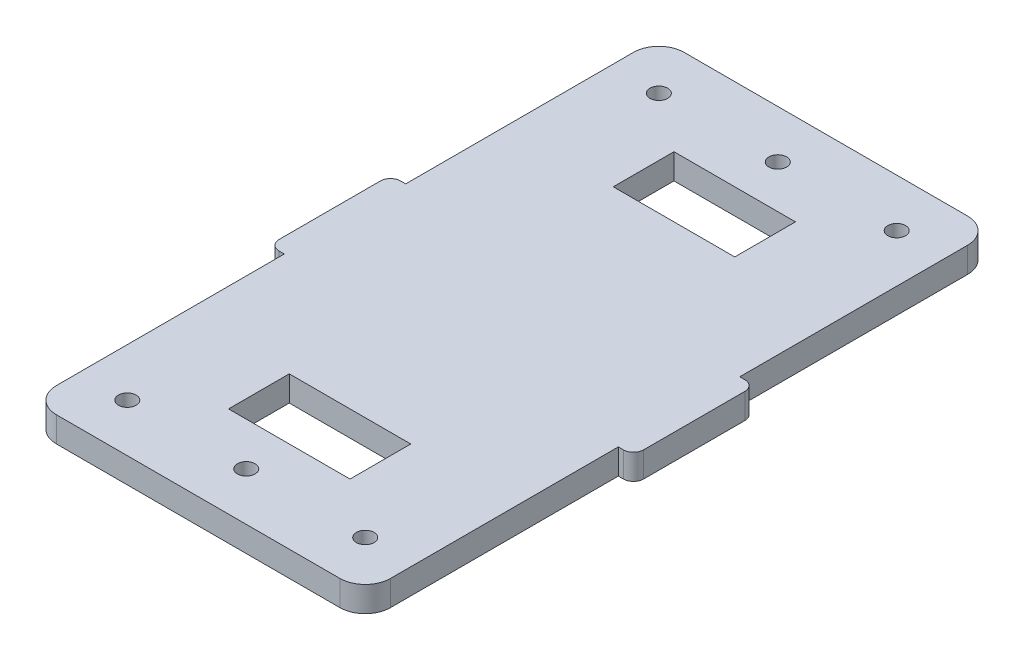
ISO-10303-21;
HEADER;
FILE_DESCRIPTION(('STEP AP214'),'2;1');
FILE_NAME('part.step','',(''),(''),'','','');
FILE_SCHEMA(('AUTOMOTIVE_DESIGN { 1 0 10303 214 1 1 1 1 }'));
ENDSEC;
DATA;
#1=APPLICATION_CONTEXT('core data for automotive mechanical design processes');
#2=APPLICATION_PROTOCOL_DEFINITION('international standard','automotive_design',2000,#1);
#3=PRODUCT_CONTEXT('',#1,'mechanical');
#4=PRODUCT('Part','Part','',(#3));
#5=PRODUCT_RELATED_PRODUCT_CATEGORY('part','',(#4));
#6=PRODUCT_DEFINITION_FORMATION('','',#4);
#7=PRODUCT_DEFINITION_CONTEXT('part definition',#1,'design');
#8=PRODUCT_DEFINITION('design','',#6,#7);
#9=PRODUCT_DEFINITION_SHAPE('','',#8);
#10=(LENGTH_UNIT() NAMED_UNIT(*) SI_UNIT(.MILLI.,.METRE.));
#11=(NAMED_UNIT(*) PLANE_ANGLE_UNIT() SI_UNIT($,.RADIAN.));
#12=(NAMED_UNIT(*) SI_UNIT($,.STERADIAN.) SOLID_ANGLE_UNIT());
#13=UNCERTAINTY_MEASURE_WITH_UNIT(LENGTH_MEASURE(1.E-05),#10,'distance_accuracy_value','');
#14=(GEOMETRIC_REPRESENTATION_CONTEXT(3) GLOBAL_UNCERTAINTY_ASSIGNED_CONTEXT((#13)) GLOBAL_UNIT_ASSIGNED_CONTEXT((#10,
#11,#12)) REPRESENTATION_CONTEXT('',''));
#15=CARTESIAN_POINT('',(0.,0.,0.));
#16=DIRECTION('',(0.,0.,1.));
#17=DIRECTION('',(1.,0.,0.));
#18=AXIS2_PLACEMENT_3D('',#15,#16,#17);
#19=CARTESIAN_POINT('',(36.,5.,-50.));
#20=DIRECTION('',(-1.,0.,0.));
#21=DIRECTION('',(0.,0.,1.));
#22=AXIS2_PLACEMENT_3D('',#19,#20,#21);
#23=PLANE('',#22);
#24=DIRECTION('',(0.,0.,-1.));
#25=VECTOR('',#24,1.);
#26=CARTESIAN_POINT('',(36.,5.,-50.));
#27=LINE('',#26,#25);
#28=CARTESIAN_POINT('',(36.,5.,22.));
#29=VERTEX_POINT('',#28);
#30=CARTESIAN_POINT('',(36.,5.,2.));
#31=VERTEX_POINT('',#30);
#32=EDGE_CURVE('E380',#29,#31,#27,.T.);
#33=ORIENTED_EDGE('',*,*,#32,.F.);
#34=DIRECTION('',(0.,1.,0.));
#35=VECTOR('',#34,1.);
#36=CARTESIAN_POINT('',(36.,5.,22.));
#37=LINE('',#36,#35);
#38=CARTESIAN_POINT('',(36.,0.,22.));
#39=VERTEX_POINT('',#38);
#40=EDGE_CURVE('E447',#29,#39,#37,.F.);
#41=ORIENTED_EDGE('',*,*,#40,.T.);
#42=DIRECTION('',(0.,0.,-1.));
#43=VECTOR('',#42,1.);
#44=CARTESIAN_POINT('',(36.,0.,-50.));
#45=LINE('',#44,#43);
#46=CARTESIAN_POINT('',(36.,0.,2.));
#47=VERTEX_POINT('',#46);
#48=EDGE_CURVE('E379',#39,#47,#45,.T.);
#49=ORIENTED_EDGE('',*,*,#48,.T.);
#50=DIRECTION('',(0.,1.,0.));
#51=VECTOR('',#50,1.);
#52=CARTESIAN_POINT('',(36.,5.,2.));
#53=LINE('',#52,#51);
#54=EDGE_CURVE('E444',#47,#31,#53,.T.);
#55=ORIENTED_EDGE('',*,*,#54,.T.);
#56=EDGE_LOOP('',(#33,#41,#49,#55));
#57=FACE_BOUND('',#56,.T.);
#58=ADVANCED_FACE('F33',(#57),#23,.F.);
#59=CARTESIAN_POINT('',(-36.,5.,-50.));
#60=DIRECTION('',(0.,0.,1.));
#61=DIRECTION('',(1.,0.,0.));
#62=AXIS2_PLACEMENT_3D('',#59,#60,#61);
#63=PLANE('',#62);
#64=DIRECTION('',(-1.,0.,0.));
#65=VECTOR('',#64,1.);
#66=CARTESIAN_POINT('',(-36.,5.,-50.));
#67=LINE('',#66,#65);
#68=CARTESIAN_POINT('',(28.,5.,-50.));
#69=VERTEX_POINT('',#68);
#70=CARTESIAN_POINT('',(-28.,5.,-50.));
#71=VERTEX_POINT('',#70);
#72=EDGE_CURVE('E383',#69,#71,#67,.T.);
#73=ORIENTED_EDGE('',*,*,#72,.F.);
#74=DIRECTION('',(0.,1.,0.));
#75=VECTOR('',#74,1.);
#76=CARTESIAN_POINT('',(28.,5.,-50.));
#77=LINE('',#76,#75);
#78=CARTESIAN_POINT('',(28.,0.,-50.));
#79=VERTEX_POINT('',#78);
#80=EDGE_CURVE('E429',#69,#79,#77,.F.);
#81=ORIENTED_EDGE('',*,*,#80,.T.);
#82=DIRECTION('',(-1.,0.,0.));
#83=VECTOR('',#82,1.);
#84=CARTESIAN_POINT('',(-36.,0.,-50.));
#85=LINE('',#84,#83);
#86=CARTESIAN_POINT('',(-28.,0.,-50.));
#87=VERTEX_POINT('',#86);
#88=EDGE_CURVE('E393',#79,#87,#85,.T.);
#89=ORIENTED_EDGE('',*,*,#88,.T.);
#90=DIRECTION('',(0.,1.,0.));
#91=VECTOR('',#90,1.);
#92=CARTESIAN_POINT('',(-28.,5.,-50.));
#93=LINE('',#92,#91);
#94=EDGE_CURVE('E426',#87,#71,#93,.T.);
#95=ORIENTED_EDGE('',*,*,#94,.T.);
#96=EDGE_LOOP('',(#73,#81,#89,#95));
#97=FACE_BOUND('',#96,.T.);
#98=ADVANCED_FACE('F499',(#97),#63,.F.);
#99=CARTESIAN_POINT('',(-36.,5.,-50.));
#100=DIRECTION('',(1.,0.,0.));
#101=DIRECTION('',(0.,0.,-1.));
#102=AXIS2_PLACEMENT_3D('',#99,#100,#101);
#103=PLANE('',#102);
#104=DIRECTION('',(0.,0.,1.));
#105=VECTOR('',#104,1.);
#106=CARTESIAN_POINT('',(-36.,0.,-50.));
#107=LINE('',#106,#105);
#108=CARTESIAN_POINT('',(-36.,0.,2.));
#109=VERTEX_POINT('',#108);
#110=CARTESIAN_POINT('',(-36.,0.,22.));
#111=VERTEX_POINT('',#110);
#112=EDGE_CURVE('E384',#109,#111,#107,.T.);
#113=ORIENTED_EDGE('',*,*,#112,.T.);
#114=DIRECTION('',(0.,1.,0.));
#115=VECTOR('',#114,1.);
#116=CARTESIAN_POINT('',(-36.,5.,22.));
#117=LINE('',#116,#115);
#118=CARTESIAN_POINT('',(-36.,5.,22.));
#119=VERTEX_POINT('',#118);
#120=EDGE_CURVE('E459',#111,#119,#117,.T.);
#121=ORIENTED_EDGE('',*,*,#120,.T.);
#122=DIRECTION('',(0.,0.,1.));
#123=VECTOR('',#122,1.);
#124=CARTESIAN_POINT('',(-36.,5.,-50.));
#125=LINE('',#124,#123);
#126=CARTESIAN_POINT('',(-36.,5.,2.));
#127=VERTEX_POINT('',#126);
#128=EDGE_CURVE('E387',#127,#119,#125,.T.);
#129=ORIENTED_EDGE('',*,*,#128,.F.);
#130=DIRECTION('',(0.,1.,0.));
#131=VECTOR('',#130,1.);
#132=CARTESIAN_POINT('',(-36.,5.,2.));
#133=LINE('',#132,#131);
#134=EDGE_CURVE('E457',#127,#109,#133,.F.);
#135=ORIENTED_EDGE('',*,*,#134,.T.);
#136=EDGE_LOOP('',(#113,#121,#129,#135));
#137=FACE_BOUND('',#136,.T.);
#138=ADVANCED_FACE('F475',(#137),#103,.F.);
#139=CARTESIAN_POINT('',(0.,5.,0.));
#140=DIRECTION('',(0.,1.,0.));
#141=DIRECTION('',(0.,0.,1.));
#142=AXIS2_PLACEMENT_3D('',#139,#140,#141);
#143=PLANE('',#142);
#144=CARTESIAN_POINT('',(0.,5.,-40.5));
#145=DIRECTION('',(0.,1.,0.));
#146=DIRECTION('',(0.,0.,1.));
#147=AXIS2_PLACEMENT_3D('',#144,#145,#146);
#148=CIRCLE('',#147,1.75);
#149=CARTESIAN_POINT('',(0.,5.,-38.75));
#150=VERTEX_POINT('',#149);
#151=EDGE_CURVE('E253',#150,#150,#148,.T.);
#152=ORIENTED_EDGE('',*,*,#151,.F.);
#153=EDGE_LOOP('',(#152));
#154=FACE_BOUND('',#153,.T.);
#155=CARTESIAN_POINT('',(0.,5.,64.5));
#156=DIRECTION('',(0.,1.,0.));
#157=DIRECTION('',(0.,0.,1.));
#158=AXIS2_PLACEMENT_3D('',#155,#156,#157);
#159=CIRCLE('',#158,1.75);
#160=CARTESIAN_POINT('',(0.,5.,66.25));
#161=VERTEX_POINT('',#160);
#162=EDGE_CURVE('E879',#161,#161,#159,.T.);
#163=ORIENTED_EDGE('',*,*,#162,.F.);
#164=EDGE_LOOP('',(#163));
#165=FACE_BOUND('',#164,.T.);
#166=DIRECTION('',(0.,0.,1.));
#167=VECTOR('',#166,1.);
#168=CARTESIAN_POINT('',(-12.,5.,0.));
#169=LINE('',#168,#167);
#170=CARTESIAN_POINT('',(-12.,5.,44.));
#171=VERTEX_POINT('',#170);
#172=CARTESIAN_POINT('',(-12.,5.,56.));
#173=VERTEX_POINT('',#172);
#174=EDGE_CURVE('E229',#171,#173,#169,.T.);
#175=ORIENTED_EDGE('',*,*,#174,.F.);
#176=DIRECTION('',(-1.,0.,0.));
#177=VECTOR('',#176,1.);
#178=CARTESIAN_POINT('',(0.,5.,44.));
#179=LINE('',#178,#177);
#180=CARTESIAN_POINT('',(12.,5.,44.));
#181=VERTEX_POINT('',#180);
#182=EDGE_CURVE('E296',#181,#171,#179,.T.);
#183=ORIENTED_EDGE('',*,*,#182,.F.);
#184=DIRECTION('',(0.,0.,-1.));
#185=VECTOR('',#184,1.);
#186=CARTESIAN_POINT('',(12.,5.,0.));
#187=LINE('',#186,#185);
#188=CARTESIAN_POINT('',(12.,5.,56.));
#189=VERTEX_POINT('',#188);
#190=EDGE_CURVE('E294',#189,#181,#187,.T.);
#191=ORIENTED_EDGE('',*,*,#190,.F.);
#192=DIRECTION('',(1.,0.,0.));
#193=VECTOR('',#192,1.);
#194=CARTESIAN_POINT('',(0.,5.,56.));
#195=LINE('',#194,#193);
#196=EDGE_CURVE('E292',#173,#189,#195,.T.);
#197=ORIENTED_EDGE('',*,*,#196,.F.);
#198=EDGE_LOOP('',(#175,#183,#191,#197));
#199=FACE_BOUND('',#198,.T.);
#200=DIRECTION('',(0.,0.,1.));
#201=VECTOR('',#200,1.);
#202=CARTESIAN_POINT('',(-12.,5.,0.));
#203=LINE('',#202,#201);
#204=CARTESIAN_POINT('',(-12.,5.,-32.));
#205=VERTEX_POINT('',#204);
#206=CARTESIAN_POINT('',(-12.,5.,-20.));
#207=VERTEX_POINT('',#206);
#208=EDGE_CURVE('E289',#205,#207,#203,.T.);
#209=ORIENTED_EDGE('',*,*,#208,.F.);
#210=DIRECTION('',(-1.,0.,0.));
#211=VECTOR('',#210,1.);
#212=CARTESIAN_POINT('',(0.,5.,-32.));
#213=LINE('',#212,#211);
#214=CARTESIAN_POINT('',(12.,5.,-32.));
#215=VERTEX_POINT('',#214);
#216=EDGE_CURVE('E287',#215,#205,#213,.T.);
#217=ORIENTED_EDGE('',*,*,#216,.F.);
#218=DIRECTION('',(0.,0.,-1.));
#219=VECTOR('',#218,1.);
#220=CARTESIAN_POINT('',(12.,5.,0.));
#221=LINE('',#220,#219);
#222=CARTESIAN_POINT('',(12.,5.,-20.));
#223=VERTEX_POINT('',#222);
#224=EDGE_CURVE('E285',#223,#215,#221,.T.);
#225=ORIENTED_EDGE('',*,*,#224,.F.);
#226=DIRECTION('',(1.,0.,0.));
#227=VECTOR('',#226,1.);
#228=CARTESIAN_POINT('',(0.,5.,-20.));
#229=LINE('',#228,#227);
#230=EDGE_CURVE('E260',#207,#223,#229,.T.);
#231=ORIENTED_EDGE('',*,*,#230,.F.);
#232=EDGE_LOOP('',(#209,#217,#225,#231));
#233=FACE_BOUND('',#232,.T.);
#234=CARTESIAN_POINT('',(23.5,5.,-40.5));
#235=DIRECTION('',(0.,1.,0.));
#236=DIRECTION('',(0.,0.,1.));
#237=AXIS2_PLACEMENT_3D('',#234,#235,#236);
#238=CIRCLE('',#237,1.75);
#239=CARTESIAN_POINT('',(23.5,5.,-38.75));
#240=VERTEX_POINT('',#239);
#241=EDGE_CURVE('E314',#240,#240,#238,.T.);
#242=ORIENTED_EDGE('',*,*,#241,.F.);
#243=EDGE_LOOP('',(#242));
#244=FACE_BOUND('',#243,.T.);
#245=CARTESIAN_POINT('',(-23.5,5.,64.5));
#246=DIRECTION('',(0.,1.,0.));
#247=DIRECTION('',(0.,0.,1.));
#248=AXIS2_PLACEMENT_3D('',#245,#246,#247);
#249=CIRCLE('',#248,1.75);
#250=CARTESIAN_POINT('',(-23.5,5.,66.25));
#251=VERTEX_POINT('',#250);
#252=EDGE_CURVE('E311',#251,#251,#249,.T.);
#253=ORIENTED_EDGE('',*,*,#252,.F.);
#254=EDGE_LOOP('',(#253));
#255=FACE_BOUND('',#254,.T.);
#256=CARTESIAN_POINT('',(23.5,5.,64.5));
#257=DIRECTION('',(0.,1.,0.));
#258=DIRECTION('',(0.,0.,1.));
#259=AXIS2_PLACEMENT_3D('',#256,#257,#258);
#260=CIRCLE('',#259,1.75);
#261=CARTESIAN_POINT('',(23.5,5.,66.25));
#262=VERTEX_POINT('',#261);
#263=EDGE_CURVE('E303',#262,#262,#260,.T.);
#264=ORIENTED_EDGE('',*,*,#263,.F.);
#265=EDGE_LOOP('',(#264));
#266=FACE_BOUND('',#265,.T.);
#267=CARTESIAN_POINT('',(-23.5,5.,-40.5));
#268=DIRECTION('',(0.,1.,0.));
#269=DIRECTION('',(0.,0.,1.));
#270=AXIS2_PLACEMENT_3D('',#267,#268,#269);
#271=CIRCLE('',#270,1.75);
#272=CARTESIAN_POINT('',(-23.5,5.,-38.75));
#273=VERTEX_POINT('',#272);
#274=EDGE_CURVE('E320',#273,#273,#271,.T.);
#275=ORIENTED_EDGE('',*,*,#274,.F.);
#276=EDGE_LOOP('',(#275));
#277=FACE_BOUND('',#276,.T.);
#278=DIRECTION('',(-1.,0.,0.));
#279=VECTOR('',#278,1.);
#280=CARTESIAN_POINT('',(0.,5.,24.));
#281=LINE('',#280,#279);
#282=CARTESIAN_POINT('',(34.,5.,24.));
#283=VERTEX_POINT('',#282);
#284=CARTESIAN_POINT('',(33.,5.,24.));
#285=VERTEX_POINT('',#284);
#286=EDGE_CURVE('E364',#283,#285,#281,.T.);
#287=ORIENTED_EDGE('',*,*,#286,.F.);
#288=CARTESIAN_POINT('',(34.,5.,22.));
#289=DIRECTION('',(0.,1.,0.));
#290=DIRECTION('',(0.,0.,1.));
#291=AXIS2_PLACEMENT_3D('',#288,#289,#290);
#292=CIRCLE('',#291,2.);
#293=EDGE_CURVE('E442',#283,#29,#292,.T.);
#294=ORIENTED_EDGE('',*,*,#293,.T.);
#295=ORIENTED_EDGE('',*,*,#32,.T.);
#296=CARTESIAN_POINT('',(34.,5.,2.));
#297=DIRECTION('',(0.,1.,0.));
#298=DIRECTION('',(0.,0.,1.));
#299=AXIS2_PLACEMENT_3D('',#296,#297,#298);
#300=CIRCLE('',#299,2.);
#301=CARTESIAN_POINT('',(34.,5.,0.));
#302=VERTEX_POINT('',#301);
#303=EDGE_CURVE('E440',#31,#302,#300,.T.);
#304=ORIENTED_EDGE('',*,*,#303,.T.);
#305=DIRECTION('',(1.,0.,0.));
#306=VECTOR('',#305,1.);
#307=CARTESIAN_POINT('',(0.,5.,0.));
#308=LINE('',#307,#306);
#309=CARTESIAN_POINT('',(33.,5.,0.));
#310=VERTEX_POINT('',#309);
#311=EDGE_CURVE('E371',#310,#302,#308,.T.);
#312=ORIENTED_EDGE('',*,*,#311,.F.);
#313=DIRECTION('',(0.,0.,1.));
#314=VECTOR('',#313,1.);
#315=CARTESIAN_POINT('',(33.,5.,0.));
#316=LINE('',#315,#314);
#317=CARTESIAN_POINT('',(33.,5.,-45.));
#318=VERTEX_POINT('',#317);
#319=EDGE_CURVE('E369',#318,#310,#316,.T.);
#320=ORIENTED_EDGE('',*,*,#319,.F.);
#321=CARTESIAN_POINT('',(28.,5.,-45.));
#322=DIRECTION('',(0.,1.,0.));
#323=DIRECTION('',(0.,0.,1.));
#324=AXIS2_PLACEMENT_3D('',#321,#322,#323);
#325=CIRCLE('',#324,5.);
#326=EDGE_CURVE('E402',#318,#69,#325,.T.);
#327=ORIENTED_EDGE('',*,*,#326,.T.);
#328=ORIENTED_EDGE('',*,*,#72,.T.);
#329=CARTESIAN_POINT('',(-28.,5.,-45.));
#330=DIRECTION('',(0.,1.,0.));
#331=DIRECTION('',(0.,0.,1.));
#332=AXIS2_PLACEMENT_3D('',#329,#330,#331);
#333=CIRCLE('',#332,5.);
#334=CARTESIAN_POINT('',(-33.,5.,-45.));
#335=VERTEX_POINT('',#334);
#336=EDGE_CURVE('E400',#71,#335,#333,.T.);
#337=ORIENTED_EDGE('',*,*,#336,.T.);
#338=DIRECTION('',(0.,0.,-1.));
#339=VECTOR('',#338,1.);
#340=CARTESIAN_POINT('',(-33.,5.,0.));
#341=LINE('',#340,#339);
#342=CARTESIAN_POINT('',(-33.,5.,0.));
#343=VERTEX_POINT('',#342);
#344=EDGE_CURVE('E361',#343,#335,#341,.T.);
#345=ORIENTED_EDGE('',*,*,#344,.F.);
#346=DIRECTION('',(1.,0.,0.));
#347=VECTOR('',#346,1.);
#348=CARTESIAN_POINT('',(0.,5.,0.));
#349=LINE('',#348,#347);
#350=CARTESIAN_POINT('',(-34.,5.,0.));
#351=VERTEX_POINT('',#350);
#352=EDGE_CURVE('E359',#351,#343,#349,.T.);
#353=ORIENTED_EDGE('',*,*,#352,.F.);
#354=CARTESIAN_POINT('',(-34.,5.,2.));
#355=DIRECTION('',(0.,1.,0.));
#356=DIRECTION('',(0.,0.,1.));
#357=AXIS2_PLACEMENT_3D('',#354,#355,#356);
#358=CIRCLE('',#357,2.);
#359=EDGE_CURVE('E436',#351,#127,#358,.T.);
#360=ORIENTED_EDGE('',*,*,#359,.T.);
#361=ORIENTED_EDGE('',*,*,#128,.T.);
#362=CARTESIAN_POINT('',(-34.,5.,22.));
#363=DIRECTION('',(0.,1.,0.));
#364=DIRECTION('',(0.,0.,1.));
#365=AXIS2_PLACEMENT_3D('',#362,#363,#364);
#366=CIRCLE('',#365,2.);
#367=CARTESIAN_POINT('',(-34.,5.,24.));
#368=VERTEX_POINT('',#367);
#369=EDGE_CURVE('E438',#119,#368,#366,.T.);
#370=ORIENTED_EDGE('',*,*,#369,.T.);
#371=DIRECTION('',(-1.,0.,0.));
#372=VECTOR('',#371,1.);
#373=CARTESIAN_POINT('',(0.,5.,24.));
#374=LINE('',#373,#372);
#375=CARTESIAN_POINT('',(-33.,5.,24.));
#376=VERTEX_POINT('',#375);
#377=EDGE_CURVE('E366',#376,#368,#374,.T.);
#378=ORIENTED_EDGE('',*,*,#377,.F.);
#379=DIRECTION('',(0.,0.,-1.));
#380=VECTOR('',#379,1.);
#381=CARTESIAN_POINT('',(-33.,5.,0.));
#382=LINE('',#381,#380);
#383=CARTESIAN_POINT('',(-33.,5.,69.));
#384=VERTEX_POINT('',#383);
#385=EDGE_CURVE('E357',#384,#376,#382,.T.);
#386=ORIENTED_EDGE('',*,*,#385,.F.);
#387=CARTESIAN_POINT('',(-28.,5.,69.));
#388=DIRECTION('',(0.,1.,0.));
#389=DIRECTION('',(0.,0.,1.));
#390=AXIS2_PLACEMENT_3D('',#387,#388,#389);
#391=CIRCLE('',#390,5.);
#392=CARTESIAN_POINT('',(-28.,5.,74.));
#393=VERTEX_POINT('',#392);
#394=EDGE_CURVE('E406',#384,#393,#391,.T.);
#395=ORIENTED_EDGE('',*,*,#394,.T.);
#396=DIRECTION('',(-1.,0.,0.));
#397=VECTOR('',#396,1.);
#398=CARTESIAN_POINT('',(36.,5.,74.));
#399=LINE('',#398,#397);
#400=CARTESIAN_POINT('',(28.,5.,74.));
#401=VERTEX_POINT('',#400);
#402=EDGE_CURVE('E376',#401,#393,#399,.T.);
#403=ORIENTED_EDGE('',*,*,#402,.F.);
#404=CARTESIAN_POINT('',(28.,5.,69.));
#405=DIRECTION('',(0.,1.,0.));
#406=DIRECTION('',(0.,0.,1.));
#407=AXIS2_PLACEMENT_3D('',#404,#405,#406);
#408=CIRCLE('',#407,5.);
#409=CARTESIAN_POINT('',(33.,5.,69.));
#410=VERTEX_POINT('',#409);
#411=EDGE_CURVE('E404',#401,#410,#408,.T.);
#412=ORIENTED_EDGE('',*,*,#411,.T.);
#413=DIRECTION('',(0.,0.,1.));
#414=VECTOR('',#413,1.);
#415=CARTESIAN_POINT('',(33.,5.,0.));
#416=LINE('',#415,#414);
#417=EDGE_CURVE('E354',#285,#410,#416,.T.);
#418=ORIENTED_EDGE('',*,*,#417,.F.);
#419=EDGE_LOOP('',(#287,#294,#295,#304,#312,#320,#327,#328,#337,#345,#353,#360,#361,#370,#378,
#386,#395,#403,#412,#418));
#420=FACE_BOUND('',#419,.T.);
#421=ADVANCED_FACE('F479',(#154,#165,#199,#233,#244,#255,#266,#277,#420),#143,.T.);
#422=CARTESIAN_POINT('',(0.,0.,0.));
#423=DIRECTION('',(0.,1.,0.));
#424=DIRECTION('',(0.,0.,1.));
#425=AXIS2_PLACEMENT_3D('',#422,#423,#424);
#426=PLANE('',#425);
#427=CARTESIAN_POINT('',(0.,0.,-40.5));
#428=DIRECTION('',(0.,1.,0.));
#429=DIRECTION('',(0.,0.,1.));
#430=AXIS2_PLACEMENT_3D('',#427,#428,#429);
#431=CIRCLE('',#430,1.75);
#432=CARTESIAN_POINT('',(0.,0.,-38.75));
#433=VERTEX_POINT('',#432);
#434=EDGE_CURVE('E874',#433,#433,#431,.T.);
#435=ORIENTED_EDGE('',*,*,#434,.T.);
#436=EDGE_LOOP('',(#435));
#437=FACE_BOUND('',#436,.T.);
#438=CARTESIAN_POINT('',(0.,0.,64.5));
#439=DIRECTION('',(0.,1.,0.));
#440=DIRECTION('',(0.,0.,1.));
#441=AXIS2_PLACEMENT_3D('',#438,#439,#440);
#442=CIRCLE('',#441,1.75);
#443=CARTESIAN_POINT('',(0.,0.,66.25));
#444=VERTEX_POINT('',#443);
#445=EDGE_CURVE('E877',#444,#444,#442,.T.);
#446=ORIENTED_EDGE('',*,*,#445,.T.);
#447=EDGE_LOOP('',(#446));
#448=FACE_BOUND('',#447,.T.);
#449=DIRECTION('',(-1.,0.,0.));
#450=VECTOR('',#449,1.);
#451=CARTESIAN_POINT('',(-12.,0.,44.));
#452=LINE('',#451,#450);
#453=CARTESIAN_POINT('',(12.,0.,44.));
#454=VERTEX_POINT('',#453);
#455=CARTESIAN_POINT('',(-12.,0.,44.));
#456=VERTEX_POINT('',#455);
#457=EDGE_CURVE('E233',#454,#456,#452,.T.);
#458=ORIENTED_EDGE('',*,*,#457,.T.);
#459=DIRECTION('',(0.,0.,1.));
#460=VECTOR('',#459,1.);
#461=CARTESIAN_POINT('',(-12.,0.,56.));
#462=LINE('',#461,#460);
#463=CARTESIAN_POINT('',(-12.,0.,56.));
#464=VERTEX_POINT('',#463);
#465=EDGE_CURVE('E226',#456,#464,#462,.T.);
#466=ORIENTED_EDGE('',*,*,#465,.T.);
#467=DIRECTION('',(1.,0.,0.));
#468=VECTOR('',#467,1.);
#469=CARTESIAN_POINT('',(-12.,0.,56.));
#470=LINE('',#469,#468);
#471=CARTESIAN_POINT('',(12.,0.,56.));
#472=VERTEX_POINT('',#471);
#473=EDGE_CURVE('E237',#464,#472,#470,.T.);
#474=ORIENTED_EDGE('',*,*,#473,.T.);
#475=DIRECTION('',(0.,0.,-1.));
#476=VECTOR('',#475,1.);
#477=CARTESIAN_POINT('',(12.,0.,56.));
#478=LINE('',#477,#476);
#479=EDGE_CURVE('E242',#472,#454,#478,.T.);
#480=ORIENTED_EDGE('',*,*,#479,.T.);
#481=EDGE_LOOP('',(#458,#466,#474,#480));
#482=FACE_BOUND('',#481,.T.);
#483=DIRECTION('',(-1.,0.,0.));
#484=VECTOR('',#483,1.);
#485=CARTESIAN_POINT('',(-12.,0.,-32.));
#486=LINE('',#485,#484);
#487=CARTESIAN_POINT('',(12.,0.,-32.));
#488=VERTEX_POINT('',#487);
#489=CARTESIAN_POINT('',(-12.,0.,-32.));
#490=VERTEX_POINT('',#489);
#491=EDGE_CURVE('E274',#488,#490,#486,.T.);
#492=ORIENTED_EDGE('',*,*,#491,.T.);
#493=DIRECTION('',(0.,0.,1.));
#494=VECTOR('',#493,1.);
#495=CARTESIAN_POINT('',(-12.,0.,-20.));
#496=LINE('',#495,#494);
#497=CARTESIAN_POINT('',(-12.,0.,-20.));
#498=VERTEX_POINT('',#497);
#499=EDGE_CURVE('E265',#490,#498,#496,.T.);
#500=ORIENTED_EDGE('',*,*,#499,.T.);
#501=DIRECTION('',(1.,0.,0.));
#502=VECTOR('',#501,1.);
#503=CARTESIAN_POINT('',(-12.,0.,-20.));
#504=LINE('',#503,#502);
#505=CARTESIAN_POINT('',(12.,0.,-20.));
#506=VERTEX_POINT('',#505);
#507=EDGE_CURVE('E268',#498,#506,#504,.T.);
#508=ORIENTED_EDGE('',*,*,#507,.T.);
#509=DIRECTION('',(0.,0.,-1.));
#510=VECTOR('',#509,1.);
#511=CARTESIAN_POINT('',(12.,0.,-20.));
#512=LINE('',#511,#510);
#513=EDGE_CURVE('E271',#506,#488,#512,.T.);
#514=ORIENTED_EDGE('',*,*,#513,.T.);
#515=EDGE_LOOP('',(#492,#500,#508,#514));
#516=FACE_BOUND('',#515,.T.);
#517=CARTESIAN_POINT('',(23.5,0.,-40.5));
#518=DIRECTION('',(0.,1.,0.));
#519=DIRECTION('',(0.,0.,1.));
#520=AXIS2_PLACEMENT_3D('',#517,#518,#519);
#521=CIRCLE('',#520,1.75);
#522=CARTESIAN_POINT('',(23.5,0.,-38.75));
#523=VERTEX_POINT('',#522);
#524=EDGE_CURVE('E300',#523,#523,#521,.T.);
#525=ORIENTED_EDGE('',*,*,#524,.T.);
#526=EDGE_LOOP('',(#525));
#527=FACE_BOUND('',#526,.T.);
#528=CARTESIAN_POINT('',(-23.5,0.,64.5));
#529=DIRECTION('',(0.,1.,0.));
#530=DIRECTION('',(0.,0.,1.));
#531=AXIS2_PLACEMENT_3D('',#528,#529,#530);
#532=CIRCLE('',#531,1.75);
#533=CARTESIAN_POINT('',(-23.5,0.,66.25));
#534=VERTEX_POINT('',#533);
#535=EDGE_CURVE('E304',#534,#534,#532,.T.);
#536=ORIENTED_EDGE('',*,*,#535,.T.);
#537=EDGE_LOOP('',(#536));
#538=FACE_BOUND('',#537,.T.);
#539=CARTESIAN_POINT('',(23.5,0.,64.5));
#540=DIRECTION('',(0.,1.,0.));
#541=DIRECTION('',(0.,0.,1.));
#542=AXIS2_PLACEMENT_3D('',#539,#540,#541);
#543=CIRCLE('',#542,1.75);
#544=CARTESIAN_POINT('',(23.5,0.,66.25));
#545=VERTEX_POINT('',#544);
#546=EDGE_CURVE('E299',#545,#545,#543,.T.);
#547=ORIENTED_EDGE('',*,*,#546,.T.);
#548=EDGE_LOOP('',(#547));
#549=FACE_BOUND('',#548,.T.);
#550=CARTESIAN_POINT('',(-23.5,0.,-40.5));
#551=DIRECTION('',(0.,1.,0.));
#552=DIRECTION('',(0.,0.,1.));
#553=AXIS2_PLACEMENT_3D('',#550,#551,#552);
#554=CIRCLE('',#553,1.75);
#555=CARTESIAN_POINT('',(-23.5,0.,-38.75));
#556=VERTEX_POINT('',#555);
#557=EDGE_CURVE('E317',#556,#556,#554,.T.);
#558=ORIENTED_EDGE('',*,*,#557,.T.);
#559=EDGE_LOOP('',(#558));
#560=FACE_BOUND('',#559,.T.);
#561=ORIENTED_EDGE('',*,*,#48,.F.);
#562=CARTESIAN_POINT('',(34.,0.,22.));
#563=DIRECTION('',(0.,1.,0.));
#564=DIRECTION('',(0.,0.,1.));
#565=AXIS2_PLACEMENT_3D('',#562,#563,#564);
#566=CIRCLE('',#565,2.);
#567=CARTESIAN_POINT('',(34.,0.,24.));
#568=VERTEX_POINT('',#567);
#569=EDGE_CURVE('E454',#39,#568,#566,.F.);
#570=ORIENTED_EDGE('',*,*,#569,.T.);
#571=DIRECTION('',(-1.,0.,0.));
#572=VECTOR('',#571,1.);
#573=CARTESIAN_POINT('',(36.,0.,24.));
#574=LINE('',#573,#572);
#575=CARTESIAN_POINT('',(33.,0.,24.));
#576=VERTEX_POINT('',#575);
#577=EDGE_CURVE('E323',#568,#576,#574,.T.);
#578=ORIENTED_EDGE('',*,*,#577,.T.);
#579=DIRECTION('',(0.,0.,1.));
#580=VECTOR('',#579,1.);
#581=CARTESIAN_POINT('',(33.,0.,74.));
#582=LINE('',#581,#580);
#583=CARTESIAN_POINT('',(33.,0.,69.));
#584=VERTEX_POINT('',#583);
#585=EDGE_CURVE('E325',#576,#584,#582,.T.);
#586=ORIENTED_EDGE('',*,*,#585,.T.);
#587=CARTESIAN_POINT('',(28.,0.,69.));
#588=DIRECTION('',(0.,1.,0.));
#589=DIRECTION('',(0.,0.,1.));
#590=AXIS2_PLACEMENT_3D('',#587,#588,#589);
#591=CIRCLE('',#590,5.);
#592=CARTESIAN_POINT('',(28.,0.,74.));
#593=VERTEX_POINT('',#592);
#594=EDGE_CURVE('E417',#584,#593,#591,.F.);
#595=ORIENTED_EDGE('',*,*,#594,.T.);
#596=DIRECTION('',(1.,0.,0.));
#597=VECTOR('',#596,1.);
#598=CARTESIAN_POINT('',(-36.,0.,74.));
#599=LINE('',#598,#597);
#600=CARTESIAN_POINT('',(-28.,0.,74.));
#601=VERTEX_POINT('',#600);
#602=EDGE_CURVE('E373',#601,#593,#599,.T.);
#603=ORIENTED_EDGE('',*,*,#602,.F.);
#604=CARTESIAN_POINT('',(-28.,0.,69.));
#605=DIRECTION('',(0.,1.,0.));
#606=DIRECTION('',(0.,0.,1.));
#607=AXIS2_PLACEMENT_3D('',#604,#605,#606);
#608=CIRCLE('',#607,5.);
#609=CARTESIAN_POINT('',(-33.,0.,69.));
#610=VERTEX_POINT('',#609);
#611=EDGE_CURVE('E419',#601,#610,#608,.F.);
#612=ORIENTED_EDGE('',*,*,#611,.T.);
#613=DIRECTION('',(0.,0.,-1.));
#614=VECTOR('',#613,1.);
#615=CARTESIAN_POINT('',(-33.,0.,74.));
#616=LINE('',#615,#614);
#617=CARTESIAN_POINT('',(-33.,0.,24.));
#618=VERTEX_POINT('',#617);
#619=EDGE_CURVE('E331',#610,#618,#616,.T.);
#620=ORIENTED_EDGE('',*,*,#619,.T.);
#621=DIRECTION('',(-1.,0.,0.));
#622=VECTOR('',#621,1.);
#623=CARTESIAN_POINT('',(-36.,0.,24.));
#624=LINE('',#623,#622);
#625=CARTESIAN_POINT('',(-34.,0.,24.));
#626=VERTEX_POINT('',#625);
#627=EDGE_CURVE('E342',#618,#626,#624,.T.);
#628=ORIENTED_EDGE('',*,*,#627,.T.);
#629=CARTESIAN_POINT('',(-34.,0.,22.));
#630=DIRECTION('',(0.,1.,0.));
#631=DIRECTION('',(0.,0.,1.));
#632=AXIS2_PLACEMENT_3D('',#629,#630,#631);
#633=CIRCLE('',#632,2.);
#634=EDGE_CURVE('E450',#626,#111,#633,.F.);
#635=ORIENTED_EDGE('',*,*,#634,.T.);
#636=ORIENTED_EDGE('',*,*,#112,.F.);
#637=CARTESIAN_POINT('',(-34.,0.,2.));
#638=DIRECTION('',(0.,1.,0.));
#639=DIRECTION('',(0.,0.,1.));
#640=AXIS2_PLACEMENT_3D('',#637,#638,#639);
#641=CIRCLE('',#640,2.);
#642=CARTESIAN_POINT('',(-34.,0.,0.));
#643=VERTEX_POINT('',#642);
#644=EDGE_CURVE('E56',#109,#643,#641,.F.);
#645=ORIENTED_EDGE('',*,*,#644,.T.);
#646=DIRECTION('',(1.,0.,0.));
#647=VECTOR('',#646,1.);
#648=CARTESIAN_POINT('',(-36.,0.,0.));
#649=LINE('',#648,#647);
#650=CARTESIAN_POINT('',(-33.,0.,0.));
#651=VERTEX_POINT('',#650);
#652=EDGE_CURVE('E340',#643,#651,#649,.T.);
#653=ORIENTED_EDGE('',*,*,#652,.T.);
#654=DIRECTION('',(0.,0.,-1.));
#655=VECTOR('',#654,1.);
#656=CARTESIAN_POINT('',(-33.,0.,-50.));
#657=LINE('',#656,#655);
#658=CARTESIAN_POINT('',(-33.,0.,-45.));
#659=VERTEX_POINT('',#658);
#660=EDGE_CURVE('E348',#651,#659,#657,.T.);
#661=ORIENTED_EDGE('',*,*,#660,.T.);
#662=CARTESIAN_POINT('',(-28.,0.,-45.));
#663=DIRECTION('',(0.,1.,0.));
#664=DIRECTION('',(0.,0.,1.));
#665=AXIS2_PLACEMENT_3D('',#662,#663,#664);
#666=CIRCLE('',#665,5.);
#667=EDGE_CURVE('E413',#659,#87,#666,.F.);
#668=ORIENTED_EDGE('',*,*,#667,.T.);
#669=ORIENTED_EDGE('',*,*,#88,.F.);
#670=CARTESIAN_POINT('',(28.,0.,-45.));
#671=DIRECTION('',(0.,1.,0.));
#672=DIRECTION('',(0.,0.,1.));
#673=AXIS2_PLACEMENT_3D('',#670,#671,#672);
#674=CIRCLE('',#673,5.);
#675=CARTESIAN_POINT('',(33.,0.,-45.));
#676=VERTEX_POINT('',#675);
#677=EDGE_CURVE('E415',#79,#676,#674,.F.);
#678=ORIENTED_EDGE('',*,*,#677,.T.);
#679=DIRECTION('',(0.,0.,1.));
#680=VECTOR('',#679,1.);
#681=CARTESIAN_POINT('',(33.,0.,-50.));
#682=LINE('',#681,#680);
#683=CARTESIAN_POINT('',(33.,0.,0.));
#684=VERTEX_POINT('',#683);
#685=EDGE_CURVE('E332',#676,#684,#682,.T.);
#686=ORIENTED_EDGE('',*,*,#685,.T.);
#687=DIRECTION('',(1.,0.,0.));
#688=VECTOR('',#687,1.);
#689=CARTESIAN_POINT('',(36.,0.,0.));
#690=LINE('',#689,#688);
#691=CARTESIAN_POINT('',(34.,0.,0.));
#692=VERTEX_POINT('',#691);
#693=EDGE_CURVE('E334',#684,#692,#690,.T.);
#694=ORIENTED_EDGE('',*,*,#693,.T.);
#695=CARTESIAN_POINT('',(34.,0.,2.));
#696=DIRECTION('',(0.,1.,0.));
#697=DIRECTION('',(0.,0.,1.));
#698=AXIS2_PLACEMENT_3D('',#695,#696,#697);
#699=CIRCLE('',#698,2.);
#700=EDGE_CURVE('E452',#692,#47,#699,.F.);
#701=ORIENTED_EDGE('',*,*,#700,.T.);
#702=EDGE_LOOP('',(#561,#570,#578,#586,#595,#603,#612,#620,#628,#635,#636,#645,#653,#661,#668,
#669,#678,#686,#694,#701));
#703=FACE_BOUND('',#702,.T.);
#704=ADVANCED_FACE('F244',(#437,#448,#482,#516,#527,#538,#549,#560,#703),#426,.F.);
#705=CARTESIAN_POINT('',(0.,0.,74.));
#706=DIRECTION('',(0.,0.,1.));
#707=DIRECTION('',(1.,0.,0.));
#708=AXIS2_PLACEMENT_3D('',#705,#706,#707);
#709=PLANE('',#708);
#710=ORIENTED_EDGE('',*,*,#402,.T.);
#711=DIRECTION('',(0.,1.,0.));
#712=VECTOR('',#711,1.);
#713=CARTESIAN_POINT('',(-28.,0.,74.));
#714=LINE('',#713,#712);
#715=EDGE_CURVE('E411',#393,#601,#714,.F.);
#716=ORIENTED_EDGE('',*,*,#715,.T.);
#717=ORIENTED_EDGE('',*,*,#602,.T.);
#718=DIRECTION('',(0.,1.,0.));
#719=VECTOR('',#718,1.);
#720=CARTESIAN_POINT('',(28.,5.,74.));
#721=LINE('',#720,#719);
#722=EDGE_CURVE('E408',#593,#401,#721,.T.);
#723=ORIENTED_EDGE('',*,*,#722,.T.);
#724=EDGE_LOOP('',(#710,#716,#717,#723));
#725=FACE_BOUND('',#724,.T.);
#726=ADVANCED_FACE('F539',(#725),#709,.T.);
#727=CARTESIAN_POINT('',(33.,0.,74.));
#728=DIRECTION('',(-1.,0.,0.));
#729=DIRECTION('',(0.,0.,1.));
#730=AXIS2_PLACEMENT_3D('',#727,#728,#729);
#731=PLANE('',#730);
#732=ORIENTED_EDGE('',*,*,#417,.T.);
#733=DIRECTION('',(0.,1.,0.));
#734=VECTOR('',#733,1.);
#735=CARTESIAN_POINT('',(33.,0.,69.));
#736=LINE('',#735,#734);
#737=EDGE_CURVE('E421',#410,#584,#736,.F.);
#738=ORIENTED_EDGE('',*,*,#737,.T.);
#739=ORIENTED_EDGE('',*,*,#585,.F.);
#740=DIRECTION('',(0.,1.,0.));
#741=VECTOR('',#740,1.);
#742=CARTESIAN_POINT('',(33.,0.,24.));
#743=LINE('',#742,#741);
#744=EDGE_CURVE('E328',#576,#285,#743,.T.);
#745=ORIENTED_EDGE('',*,*,#744,.T.);
#746=EDGE_LOOP('',(#732,#738,#739,#745));
#747=FACE_BOUND('',#746,.T.);
#748=ADVANCED_FACE('F530',(#747),#731,.F.);
#749=CARTESIAN_POINT('',(36.,0.,24.));
#750=DIRECTION('',(0.,0.,-1.));
#751=DIRECTION('',(-1.,0.,0.));
#752=AXIS2_PLACEMENT_3D('',#749,#750,#751);
#753=PLANE('',#752);
#754=ORIENTED_EDGE('',*,*,#577,.F.);
#755=DIRECTION('',(0.,1.,0.));
#756=VECTOR('',#755,1.);
#757=CARTESIAN_POINT('',(34.,0.,24.));
#758=LINE('',#757,#756);
#759=EDGE_CURVE('E433',#568,#283,#758,.T.);
#760=ORIENTED_EDGE('',*,*,#759,.T.);
#761=ORIENTED_EDGE('',*,*,#286,.T.);
#762=ORIENTED_EDGE('',*,*,#744,.F.);
#763=EDGE_LOOP('',(#754,#760,#761,#762));
#764=FACE_BOUND('',#763,.T.);
#765=ADVANCED_FACE('F524',(#764),#753,.F.);
#766=CARTESIAN_POINT('',(-36.,0.,24.));
#767=DIRECTION('',(0.,0.,-1.));
#768=DIRECTION('',(-1.,0.,0.));
#769=AXIS2_PLACEMENT_3D('',#766,#767,#768);
#770=PLANE('',#769);
#771=ORIENTED_EDGE('',*,*,#377,.T.);
#772=DIRECTION('',(0.,1.,0.));
#773=VECTOR('',#772,1.);
#774=CARTESIAN_POINT('',(-34.,0.,24.));
#775=LINE('',#774,#773);
#776=EDGE_CURVE('E41',#368,#626,#775,.F.);
#777=ORIENTED_EDGE('',*,*,#776,.T.);
#778=ORIENTED_EDGE('',*,*,#627,.F.);
#779=DIRECTION('',(0.,1.,0.));
#780=VECTOR('',#779,1.);
#781=CARTESIAN_POINT('',(-33.,0.,24.));
#782=LINE('',#781,#780);
#783=EDGE_CURVE('E335',#618,#376,#782,.T.);
#784=ORIENTED_EDGE('',*,*,#783,.T.);
#785=EDGE_LOOP('',(#771,#777,#778,#784));
#786=FACE_BOUND('',#785,.T.);
#787=ADVANCED_FACE('F464',(#786),#770,.F.);
#788=CARTESIAN_POINT('',(-33.,0.,74.));
#789=DIRECTION('',(1.,0.,0.));
#790=DIRECTION('',(0.,0.,-1.));
#791=AXIS2_PLACEMENT_3D('',#788,#789,#790);
#792=PLANE('',#791);
#793=ORIENTED_EDGE('',*,*,#619,.F.);
#794=DIRECTION('',(0.,1.,0.));
#795=VECTOR('',#794,1.);
#796=CARTESIAN_POINT('',(-33.,5.,69.));
#797=LINE('',#796,#795);
#798=EDGE_CURVE('E390',#610,#384,#797,.T.);
#799=ORIENTED_EDGE('',*,*,#798,.T.);
#800=ORIENTED_EDGE('',*,*,#385,.T.);
#801=ORIENTED_EDGE('',*,*,#783,.F.);
#802=EDGE_LOOP('',(#793,#799,#800,#801));
#803=FACE_BOUND('',#802,.T.);
#804=ADVANCED_FACE('F545',(#803),#792,.F.);
#805=CARTESIAN_POINT('',(-33.,0.,-50.));
#806=DIRECTION('',(1.,0.,0.));
#807=DIRECTION('',(0.,0.,-1.));
#808=AXIS2_PLACEMENT_3D('',#805,#806,#807);
#809=PLANE('',#808);
#810=ORIENTED_EDGE('',*,*,#344,.T.);
#811=DIRECTION('',(0.,1.,0.));
#812=VECTOR('',#811,1.);
#813=CARTESIAN_POINT('',(-33.,0.,-45.));
#814=LINE('',#813,#812);
#815=EDGE_CURVE('E431',#335,#659,#814,.F.);
#816=ORIENTED_EDGE('',*,*,#815,.T.);
#817=ORIENTED_EDGE('',*,*,#660,.F.);
#818=DIRECTION('',(0.,1.,0.));
#819=VECTOR('',#818,1.);
#820=CARTESIAN_POINT('',(-33.,0.,0.));
#821=LINE('',#820,#819);
#822=EDGE_CURVE('E351',#651,#343,#821,.T.);
#823=ORIENTED_EDGE('',*,*,#822,.T.);
#824=EDGE_LOOP('',(#810,#816,#817,#823));
#825=FACE_BOUND('',#824,.T.);
#826=ADVANCED_FACE('F490',(#825),#809,.F.);
#827=CARTESIAN_POINT('',(-36.,0.,0.));
#828=DIRECTION('',(0.,0.,1.));
#829=DIRECTION('',(1.,0.,0.));
#830=AXIS2_PLACEMENT_3D('',#827,#828,#829);
#831=PLANE('',#830);
#832=ORIENTED_EDGE('',*,*,#652,.F.);
#833=DIRECTION('',(0.,1.,0.));
#834=VECTOR('',#833,1.);
#835=CARTESIAN_POINT('',(-34.,0.,0.));
#836=LINE('',#835,#834);
#837=EDGE_CURVE('E11',#643,#351,#836,.T.);
#838=ORIENTED_EDGE('',*,*,#837,.T.);
#839=ORIENTED_EDGE('',*,*,#352,.T.);
#840=ORIENTED_EDGE('',*,*,#822,.F.);
#841=EDGE_LOOP('',(#832,#838,#839,#840));
#842=FACE_BOUND('',#841,.T.);
#843=ADVANCED_FACE('F485',(#842),#831,.F.);
#844=CARTESIAN_POINT('',(36.,0.,0.));
#845=DIRECTION('',(0.,0.,1.));
#846=DIRECTION('',(1.,0.,0.));
#847=AXIS2_PLACEMENT_3D('',#844,#845,#846);
#848=PLANE('',#847);
#849=ORIENTED_EDGE('',*,*,#311,.T.);
#850=DIRECTION('',(0.,1.,0.));
#851=VECTOR('',#850,1.);
#852=CARTESIAN_POINT('',(34.,0.,0.));
#853=LINE('',#852,#851);
#854=EDGE_CURVE('E48',#302,#692,#853,.F.);
#855=ORIENTED_EDGE('',*,*,#854,.T.);
#856=ORIENTED_EDGE('',*,*,#693,.F.);
#857=DIRECTION('',(0.,1.,0.));
#858=VECTOR('',#857,1.);
#859=CARTESIAN_POINT('',(33.,0.,0.));
#860=LINE('',#859,#858);
#861=EDGE_CURVE('E337',#684,#310,#860,.T.);
#862=ORIENTED_EDGE('',*,*,#861,.T.);
#863=EDGE_LOOP('',(#849,#855,#856,#862));
#864=FACE_BOUND('',#863,.T.);
#865=ADVANCED_FACE('F510',(#864),#848,.F.);
#866=CARTESIAN_POINT('',(33.,0.,-50.));
#867=DIRECTION('',(-1.,0.,0.));
#868=DIRECTION('',(0.,0.,1.));
#869=AXIS2_PLACEMENT_3D('',#866,#867,#868);
#870=PLANE('',#869);
#871=ORIENTED_EDGE('',*,*,#685,.F.);
#872=DIRECTION('',(0.,1.,0.));
#873=VECTOR('',#872,1.);
#874=CARTESIAN_POINT('',(33.,0.,-45.));
#875=LINE('',#874,#873);
#876=EDGE_CURVE('E423',#676,#318,#875,.T.);
#877=ORIENTED_EDGE('',*,*,#876,.T.);
#878=ORIENTED_EDGE('',*,*,#319,.T.);
#879=ORIENTED_EDGE('',*,*,#861,.F.);
#880=EDGE_LOOP('',(#871,#877,#878,#879));
#881=FACE_BOUND('',#880,.T.);
#882=ADVANCED_FACE('F507',(#881),#870,.F.);
#883=CARTESIAN_POINT('',(-23.5,0.,-40.5));
#884=DIRECTION('',(0.,1.,0.));
#885=DIRECTION('',(0.,0.,1.));
#886=AXIS2_PLACEMENT_3D('',#883,#884,#885);
#887=CYLINDRICAL_SURFACE('',#886,1.75);
#888=ORIENTED_EDGE('',*,*,#274,.T.);
#889=EDGE_LOOP('',(#888));
#890=FACE_BOUND('',#889,.T.);
#891=ORIENTED_EDGE('',*,*,#557,.F.);
#892=EDGE_LOOP('',(#891));
#893=FACE_BOUND('',#892,.T.);
#894=ADVANCED_FACE('F635',(#890,#893),#887,.F.);
#895=CARTESIAN_POINT('',(23.5,0.,64.5));
#896=DIRECTION('',(0.,1.,0.));
#897=DIRECTION('',(0.,0.,1.));
#898=AXIS2_PLACEMENT_3D('',#895,#896,#897);
#899=CYLINDRICAL_SURFACE('',#898,1.75);
#900=ORIENTED_EDGE('',*,*,#263,.T.);
#901=EDGE_LOOP('',(#900));
#902=FACE_BOUND('',#901,.T.);
#903=ORIENTED_EDGE('',*,*,#546,.F.);
#904=EDGE_LOOP('',(#903));
#905=FACE_BOUND('',#904,.T.);
#906=ADVANCED_FACE('F631',(#902,#905),#899,.F.);
#907=CARTESIAN_POINT('',(-23.5,0.,64.5));
#908=DIRECTION('',(0.,1.,0.));
#909=DIRECTION('',(0.,0.,1.));
#910=AXIS2_PLACEMENT_3D('',#907,#908,#909);
#911=CYLINDRICAL_SURFACE('',#910,1.75);
#912=ORIENTED_EDGE('',*,*,#252,.T.);
#913=EDGE_LOOP('',(#912));
#914=FACE_BOUND('',#913,.T.);
#915=ORIENTED_EDGE('',*,*,#535,.F.);
#916=EDGE_LOOP('',(#915));
#917=FACE_BOUND('',#916,.T.);
#918=ADVANCED_FACE('F627',(#914,#917),#911,.F.);
#919=CARTESIAN_POINT('',(23.5,0.,-40.5));
#920=DIRECTION('',(0.,1.,0.));
#921=DIRECTION('',(0.,0.,1.));
#922=AXIS2_PLACEMENT_3D('',#919,#920,#921);
#923=CYLINDRICAL_SURFACE('',#922,1.75);
#924=ORIENTED_EDGE('',*,*,#241,.T.);
#925=EDGE_LOOP('',(#924));
#926=FACE_BOUND('',#925,.T.);
#927=ORIENTED_EDGE('',*,*,#524,.F.);
#928=EDGE_LOOP('',(#927));
#929=FACE_BOUND('',#928,.T.);
#930=ADVANCED_FACE('F623',(#926,#929),#923,.F.);
#931=CARTESIAN_POINT('',(-12.,0.,-20.));
#932=DIRECTION('',(-1.,0.,0.));
#933=DIRECTION('',(0.,0.,1.));
#934=AXIS2_PLACEMENT_3D('',#931,#932,#933);
#935=PLANE('',#934);
#936=ORIENTED_EDGE('',*,*,#208,.T.);
#937=DIRECTION('',(0.,1.,0.));
#938=VECTOR('',#937,1.);
#939=CARTESIAN_POINT('',(-12.,0.,-20.));
#940=LINE('',#939,#938);
#941=EDGE_CURVE('E276',#498,#207,#940,.T.);
#942=ORIENTED_EDGE('',*,*,#941,.F.);
#943=ORIENTED_EDGE('',*,*,#499,.F.);
#944=DIRECTION('',(0.,1.,0.));
#945=VECTOR('',#944,1.);
#946=CARTESIAN_POINT('',(-12.,0.,-32.));
#947=LINE('',#946,#945);
#948=EDGE_CURVE('E247',#490,#205,#947,.T.);
#949=ORIENTED_EDGE('',*,*,#948,.T.);
#950=EDGE_LOOP('',(#936,#942,#943,#949));
#951=FACE_BOUND('',#950,.T.);
#952=ADVANCED_FACE('F613',(#951),#935,.F.);
#953=CARTESIAN_POINT('',(-12.,0.,-32.));
#954=DIRECTION('',(0.,0.,-1.));
#955=DIRECTION('',(-1.,0.,0.));
#956=AXIS2_PLACEMENT_3D('',#953,#954,#955);
#957=PLANE('',#956);
#958=ORIENTED_EDGE('',*,*,#216,.T.);
#959=ORIENTED_EDGE('',*,*,#948,.F.);
#960=ORIENTED_EDGE('',*,*,#491,.F.);
#961=DIRECTION('',(0.,1.,0.));
#962=VECTOR('',#961,1.);
#963=CARTESIAN_POINT('',(12.,0.,-32.));
#964=LINE('',#963,#962);
#965=EDGE_CURVE('E250',#488,#215,#964,.T.);
#966=ORIENTED_EDGE('',*,*,#965,.T.);
#967=EDGE_LOOP('',(#958,#959,#960,#966));
#968=FACE_BOUND('',#967,.T.);
#969=ADVANCED_FACE('F609',(#968),#957,.F.);
#970=CARTESIAN_POINT('',(12.,0.,-20.));
#971=DIRECTION('',(1.,0.,0.));
#972=DIRECTION('',(0.,0.,-1.));
#973=AXIS2_PLACEMENT_3D('',#970,#971,#972);
#974=PLANE('',#973);
#975=ORIENTED_EDGE('',*,*,#224,.T.);
#976=ORIENTED_EDGE('',*,*,#965,.F.);
#977=ORIENTED_EDGE('',*,*,#513,.F.);
#978=DIRECTION('',(0.,1.,0.));
#979=VECTOR('',#978,1.);
#980=CARTESIAN_POINT('',(12.,0.,-20.));
#981=LINE('',#980,#979);
#982=EDGE_CURVE('E280',#506,#223,#981,.T.);
#983=ORIENTED_EDGE('',*,*,#982,.T.);
#984=EDGE_LOOP('',(#975,#976,#977,#983));
#985=FACE_BOUND('',#984,.T.);
#986=ADVANCED_FACE('F612',(#985),#974,.F.);
#987=CARTESIAN_POINT('',(-12.,0.,-20.));
#988=DIRECTION('',(0.,0.,1.));
#989=DIRECTION('',(1.,0.,0.));
#990=AXIS2_PLACEMENT_3D('',#987,#988,#989);
#991=PLANE('',#990);
#992=ORIENTED_EDGE('',*,*,#230,.T.);
#993=ORIENTED_EDGE('',*,*,#982,.F.);
#994=ORIENTED_EDGE('',*,*,#507,.F.);
#995=ORIENTED_EDGE('',*,*,#941,.T.);
#996=EDGE_LOOP('',(#992,#993,#994,#995));
#997=FACE_BOUND('',#996,.T.);
#998=ADVANCED_FACE('F608',(#997),#991,.F.);
#999=CARTESIAN_POINT('',(-12.,0.,56.));
#1000=DIRECTION('',(-1.,0.,0.));
#1001=DIRECTION('',(0.,0.,1.));
#1002=AXIS2_PLACEMENT_3D('',#999,#1000,#1001);
#1003=PLANE('',#1002);
#1004=ORIENTED_EDGE('',*,*,#174,.T.);
#1005=DIRECTION('',(0.,1.,0.));
#1006=VECTOR('',#1005,1.);
#1007=CARTESIAN_POINT('',(-12.,0.,56.));
#1008=LINE('',#1007,#1006);
#1009=EDGE_CURVE('E221',#464,#173,#1008,.T.);
#1010=ORIENTED_EDGE('',*,*,#1009,.F.);
#1011=ORIENTED_EDGE('',*,*,#465,.F.);
#1012=DIRECTION('',(0.,1.,0.));
#1013=VECTOR('',#1012,1.);
#1014=CARTESIAN_POINT('',(-12.,0.,44.));
#1015=LINE('',#1014,#1013);
#1016=EDGE_CURVE('E258',#456,#171,#1015,.T.);
#1017=ORIENTED_EDGE('',*,*,#1016,.T.);
#1018=EDGE_LOOP('',(#1004,#1010,#1011,#1017));
#1019=FACE_BOUND('',#1018,.T.);
#1020=ADVANCED_FACE('F223',(#1019),#1003,.F.);
#1021=CARTESIAN_POINT('',(-12.,0.,44.));
#1022=DIRECTION('',(0.,0.,-1.));
#1023=DIRECTION('',(-1.,0.,0.));
#1024=AXIS2_PLACEMENT_3D('',#1021,#1022,#1023);
#1025=PLANE('',#1024);
#1026=ORIENTED_EDGE('',*,*,#182,.T.);
#1027=ORIENTED_EDGE('',*,*,#1016,.F.);
#1028=ORIENTED_EDGE('',*,*,#457,.F.);
#1029=DIRECTION('',(0.,1.,0.));
#1030=VECTOR('',#1029,1.);
#1031=CARTESIAN_POINT('',(12.,0.,44.));
#1032=LINE('',#1031,#1030);
#1033=EDGE_CURVE('E261',#454,#181,#1032,.T.);
#1034=ORIENTED_EDGE('',*,*,#1033,.T.);
#1035=EDGE_LOOP('',(#1026,#1027,#1028,#1034));
#1036=FACE_BOUND('',#1035,.T.);
#1037=ADVANCED_FACE('F596',(#1036),#1025,.F.);
#1038=CARTESIAN_POINT('',(12.,0.,56.));
#1039=DIRECTION('',(1.,0.,0.));
#1040=DIRECTION('',(0.,0.,-1.));
#1041=AXIS2_PLACEMENT_3D('',#1038,#1039,#1040);
#1042=PLANE('',#1041);
#1043=ORIENTED_EDGE('',*,*,#190,.T.);
#1044=ORIENTED_EDGE('',*,*,#1033,.F.);
#1045=ORIENTED_EDGE('',*,*,#479,.F.);
#1046=DIRECTION('',(0.,1.,0.));
#1047=VECTOR('',#1046,1.);
#1048=CARTESIAN_POINT('',(12.,0.,56.));
#1049=LINE('',#1048,#1047);
#1050=EDGE_CURVE('E232',#472,#189,#1049,.T.);
#1051=ORIENTED_EDGE('',*,*,#1050,.T.);
#1052=EDGE_LOOP('',(#1043,#1044,#1045,#1051));
#1053=FACE_BOUND('',#1052,.T.);
#1054=ADVANCED_FACE('F599',(#1053),#1042,.F.);
#1055=CARTESIAN_POINT('',(-12.,0.,56.));
#1056=DIRECTION('',(0.,0.,1.));
#1057=DIRECTION('',(1.,0.,0.));
#1058=AXIS2_PLACEMENT_3D('',#1055,#1056,#1057);
#1059=PLANE('',#1058);
#1060=ORIENTED_EDGE('',*,*,#196,.T.);
#1061=ORIENTED_EDGE('',*,*,#1050,.F.);
#1062=ORIENTED_EDGE('',*,*,#473,.F.);
#1063=ORIENTED_EDGE('',*,*,#1009,.T.);
#1064=EDGE_LOOP('',(#1060,#1061,#1062,#1063));
#1065=FACE_BOUND('',#1064,.T.);
#1066=ADVANCED_FACE('F238',(#1065),#1059,.F.);
#1067=CARTESIAN_POINT('',(-28.,0.,69.));
#1068=DIRECTION('',(0.,-1.,0.));
#1069=DIRECTION('',(0.,0.,-1.));
#1070=AXIS2_PLACEMENT_3D('',#1067,#1068,#1069);
#1071=CYLINDRICAL_SURFACE('',#1070,5.);
#1072=ORIENTED_EDGE('',*,*,#611,.F.);
#1073=ORIENTED_EDGE('',*,*,#715,.F.);
#1074=ORIENTED_EDGE('',*,*,#394,.F.);
#1075=ORIENTED_EDGE('',*,*,#798,.F.);
#1076=EDGE_LOOP('',(#1072,#1073,#1074,#1075));
#1077=FACE_BOUND('',#1076,.T.);
#1078=ADVANCED_FACE('F542',(#1077),#1071,.T.);
#1079=CARTESIAN_POINT('',(28.,0.,69.));
#1080=DIRECTION('',(0.,-1.,0.));
#1081=DIRECTION('',(0.,0.,-1.));
#1082=AXIS2_PLACEMENT_3D('',#1079,#1080,#1081);
#1083=CYLINDRICAL_SURFACE('',#1082,5.);
#1084=ORIENTED_EDGE('',*,*,#594,.F.);
#1085=ORIENTED_EDGE('',*,*,#737,.F.);
#1086=ORIENTED_EDGE('',*,*,#411,.F.);
#1087=ORIENTED_EDGE('',*,*,#722,.F.);
#1088=EDGE_LOOP('',(#1084,#1085,#1086,#1087));
#1089=FACE_BOUND('',#1088,.T.);
#1090=ADVANCED_FACE('F534',(#1089),#1083,.T.);
#1091=CARTESIAN_POINT('',(28.,0.,-45.));
#1092=DIRECTION('',(0.,1.,0.));
#1093=DIRECTION('',(0.,0.,1.));
#1094=AXIS2_PLACEMENT_3D('',#1091,#1092,#1093);
#1095=CYLINDRICAL_SURFACE('',#1094,5.);
#1096=ORIENTED_EDGE('',*,*,#677,.F.);
#1097=ORIENTED_EDGE('',*,*,#80,.F.);
#1098=ORIENTED_EDGE('',*,*,#326,.F.);
#1099=ORIENTED_EDGE('',*,*,#876,.F.);
#1100=EDGE_LOOP('',(#1096,#1097,#1098,#1099));
#1101=FACE_BOUND('',#1100,.T.);
#1102=ADVANCED_FACE('F502',(#1101),#1095,.T.);
#1103=CARTESIAN_POINT('',(-28.,5.,-45.));
#1104=DIRECTION('',(0.,1.,0.));
#1105=DIRECTION('',(0.,0.,1.));
#1106=AXIS2_PLACEMENT_3D('',#1103,#1104,#1105);
#1107=CYLINDRICAL_SURFACE('',#1106,5.);
#1108=ORIENTED_EDGE('',*,*,#667,.F.);
#1109=ORIENTED_EDGE('',*,*,#815,.F.);
#1110=ORIENTED_EDGE('',*,*,#336,.F.);
#1111=ORIENTED_EDGE('',*,*,#94,.F.);
#1112=EDGE_LOOP('',(#1108,#1109,#1110,#1111));
#1113=FACE_BOUND('',#1112,.T.);
#1114=ADVANCED_FACE('F493',(#1113),#1107,.T.);
#1115=CARTESIAN_POINT('',(34.,0.,22.));
#1116=DIRECTION('',(0.,1.,0.));
#1117=DIRECTION('',(0.,0.,1.));
#1118=AXIS2_PLACEMENT_3D('',#1115,#1116,#1117);
#1119=CYLINDRICAL_SURFACE('',#1118,2.);
#1120=ORIENTED_EDGE('',*,*,#569,.F.);
#1121=ORIENTED_EDGE('',*,*,#40,.F.);
#1122=ORIENTED_EDGE('',*,*,#293,.F.);
#1123=ORIENTED_EDGE('',*,*,#759,.F.);
#1124=EDGE_LOOP('',(#1120,#1121,#1122,#1123));
#1125=FACE_BOUND('',#1124,.T.);
#1126=ADVANCED_FACE('F522',(#1125),#1119,.T.);
#1127=CARTESIAN_POINT('',(34.,5.,2.));
#1128=DIRECTION('',(0.,1.,0.));
#1129=DIRECTION('',(0.,0.,1.));
#1130=AXIS2_PLACEMENT_3D('',#1127,#1128,#1129);
#1131=CYLINDRICAL_SURFACE('',#1130,2.);
#1132=ORIENTED_EDGE('',*,*,#700,.F.);
#1133=ORIENTED_EDGE('',*,*,#854,.F.);
#1134=ORIENTED_EDGE('',*,*,#303,.F.);
#1135=ORIENTED_EDGE('',*,*,#54,.F.);
#1136=EDGE_LOOP('',(#1132,#1133,#1134,#1135));
#1137=FACE_BOUND('',#1136,.T.);
#1138=ADVANCED_FACE('F515',(#1137),#1131,.T.);
#1139=CARTESIAN_POINT('',(-34.,5.,22.));
#1140=DIRECTION('',(0.,1.,0.));
#1141=DIRECTION('',(0.,0.,1.));
#1142=AXIS2_PLACEMENT_3D('',#1139,#1140,#1141);
#1143=CYLINDRICAL_SURFACE('',#1142,2.);
#1144=ORIENTED_EDGE('',*,*,#634,.F.);
#1145=ORIENTED_EDGE('',*,*,#776,.F.);
#1146=ORIENTED_EDGE('',*,*,#369,.F.);
#1147=ORIENTED_EDGE('',*,*,#120,.F.);
#1148=EDGE_LOOP('',(#1144,#1145,#1146,#1147));
#1149=FACE_BOUND('',#1148,.T.);
#1150=ADVANCED_FACE('F472',(#1149),#1143,.T.);
#1151=CARTESIAN_POINT('',(-34.,0.,2.));
#1152=DIRECTION('',(0.,1.,0.));
#1153=DIRECTION('',(0.,0.,1.));
#1154=AXIS2_PLACEMENT_3D('',#1151,#1152,#1153);
#1155=CYLINDRICAL_SURFACE('',#1154,2.);
#1156=ORIENTED_EDGE('',*,*,#644,.F.);
#1157=ORIENTED_EDGE('',*,*,#134,.F.);
#1158=ORIENTED_EDGE('',*,*,#359,.F.);
#1159=ORIENTED_EDGE('',*,*,#837,.F.);
#1160=EDGE_LOOP('',(#1156,#1157,#1158,#1159));
#1161=FACE_BOUND('',#1160,.T.);
#1162=ADVANCED_FACE('F35',(#1161),#1155,.T.);
#1163=CARTESIAN_POINT('',(0.,0.,64.5));
#1164=DIRECTION('',(0.,1.,0.));
#1165=DIRECTION('',(0.,0.,1.));
#1166=AXIS2_PLACEMENT_3D('',#1163,#1164,#1165);
#1167=CYLINDRICAL_SURFACE('',#1166,1.75);
#1168=ORIENTED_EDGE('',*,*,#162,.T.);
#1169=EDGE_LOOP('',(#1168));
#1170=FACE_BOUND('',#1169,.T.);
#1171=ORIENTED_EDGE('',*,*,#445,.F.);
#1172=EDGE_LOOP('',(#1171));
#1173=FACE_BOUND('',#1172,.T.);
#1174=ADVANCED_FACE('F581',(#1170,#1173),#1167,.F.);
#1175=CARTESIAN_POINT('',(0.,0.,-40.5));
#1176=DIRECTION('',(0.,1.,0.));
#1177=DIRECTION('',(0.,0.,1.));
#1178=AXIS2_PLACEMENT_3D('',#1175,#1176,#1177);
#1179=CYLINDRICAL_SURFACE('',#1178,1.75);
#1180=ORIENTED_EDGE('',*,*,#151,.T.);
#1181=EDGE_LOOP('',(#1180));
#1182=FACE_BOUND('',#1181,.T.);
#1183=ORIENTED_EDGE('',*,*,#434,.F.);
#1184=EDGE_LOOP('',(#1183));
#1185=FACE_BOUND('',#1184,.T.);
#1186=ADVANCED_FACE('F585',(#1182,#1185),#1179,.F.);
#1187=CLOSED_SHELL('',(#58,#98,#138,#421,#704,#726,#748,#765,#787,#804,#826,#843,#865,#882,#894,
#906,#918,#930,#952,#969,#986,#998,#1020,#1037,#1054,#1066,#1078,#1090,#1102,#1114,#1126,#1138,
#1150,#1162,#1174,#1186));
#1188=MANIFOLD_SOLID_BREP('B2',#1187);
#1189=ADVANCED_BREP_SHAPE_REPRESENTATION('',(#18,#1188),#14);
#1190=SHAPE_DEFINITION_REPRESENTATION(#9,#1189);
ENDSEC;
END-ISO-10303-21;
